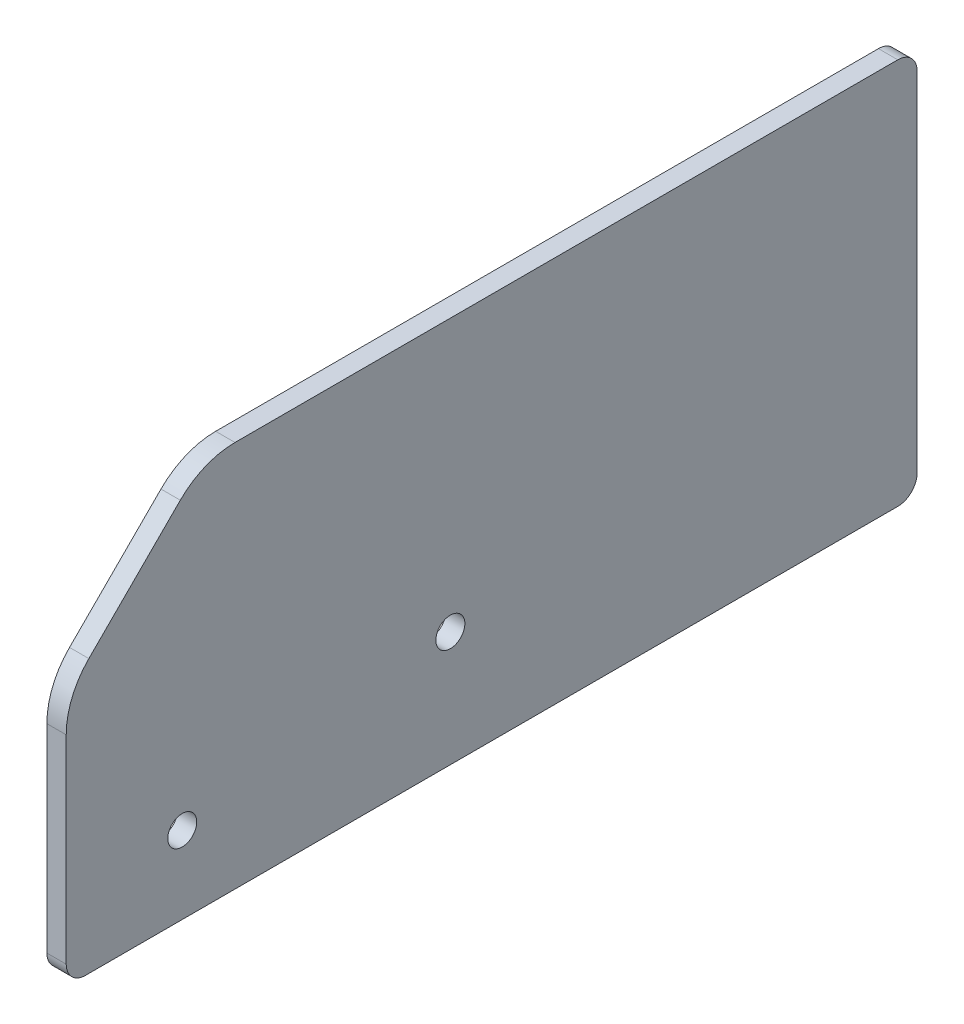
ISO-10303-21;
HEADER;
FILE_DESCRIPTION(('STEP AP214'),'2;1');
FILE_NAME('part.step','',(''),(''),'','','');
FILE_SCHEMA(('AUTOMOTIVE_DESIGN { 1 0 10303 214 1 1 1 1 }'));
ENDSEC;
DATA;
#1=APPLICATION_CONTEXT('core data for automotive mechanical design processes');
#2=APPLICATION_PROTOCOL_DEFINITION('international standard','automotive_design',2000,#1);
#3=PRODUCT_CONTEXT('',#1,'mechanical');
#4=PRODUCT('Part','Part','',(#3));
#5=PRODUCT_RELATED_PRODUCT_CATEGORY('part','',(#4));
#6=PRODUCT_DEFINITION_FORMATION('','',#4);
#7=PRODUCT_DEFINITION_CONTEXT('part definition',#1,'design');
#8=PRODUCT_DEFINITION('design','',#6,#7);
#9=PRODUCT_DEFINITION_SHAPE('','',#8);
#10=(LENGTH_UNIT() NAMED_UNIT(*) SI_UNIT(.MILLI.,.METRE.));
#11=(NAMED_UNIT(*) PLANE_ANGLE_UNIT() SI_UNIT($,.RADIAN.));
#12=(NAMED_UNIT(*) SI_UNIT($,.STERADIAN.) SOLID_ANGLE_UNIT());
#13=UNCERTAINTY_MEASURE_WITH_UNIT(LENGTH_MEASURE(1.E-05),#10,'distance_accuracy_value','');
#14=(GEOMETRIC_REPRESENTATION_CONTEXT(3) GLOBAL_UNCERTAINTY_ASSIGNED_CONTEXT((#13)) GLOBAL_UNIT_ASSIGNED_CONTEXT((#10,
#11,#12)) REPRESENTATION_CONTEXT('',''));
#15=CARTESIAN_POINT('',(0.,0.,0.));
#16=DIRECTION('',(0.,0.,1.));
#17=DIRECTION('',(1.,0.,0.));
#18=AXIS2_PLACEMENT_3D('',#15,#16,#17);
#19=CARTESIAN_POINT('',(6.35,101.6,-55.4223050896223));
#20=DIRECTION('',(-1.,0.,0.));
#21=DIRECTION('',(0.,0.,1.));
#22=AXIS2_PLACEMENT_3D('',#19,#20,#21);
#23=PLANE('',#22);
#24=CARTESIAN_POINT('',(6.35,101.6,-55.4223050896223));
#25=DIRECTION('',(1.,0.,0.));
#26=DIRECTION('',(0.,0.,1.));
#27=AXIS2_PLACEMENT_3D('',#24,#25,#26);
#28=CIRCLE('',#27,25.4);
#29=CARTESIAN_POINT('',(6.35,127.,-55.4223050896224));
#30=VERTEX_POINT('',#29);
#31=CARTESIAN_POINT('',(6.35,119.560512242138,-37.4617928474839));
#32=VERTEX_POINT('',#31);
#33=EDGE_CURVE('E161',#30,#32,#28,.T.);
#34=ORIENTED_EDGE('',*,*,#33,.T.);
#35=DIRECTION('',(0.,-0.707106781186549,0.707106781186546));
#36=VECTOR('',#35,1.);
#37=CARTESIAN_POINT('',(6.35,89.5382071525159,-7.43948775786173));
#38=LINE('',#37,#36);
#39=CARTESIAN_POINT('',(6.35,89.5382071525159,-7.43948775786173));
#40=VERTEX_POINT('',#39);
#41=EDGE_CURVE('E99',#32,#40,#38,.T.);
#42=ORIENTED_EDGE('',*,*,#41,.T.);
#43=CARTESIAN_POINT('',(6.35,71.5776949103776,-25.4));
#44=DIRECTION('',(1.,0.,0.));
#45=DIRECTION('',(0.,0.,-1.));
#46=AXIS2_PLACEMENT_3D('',#43,#44,#45);
#47=CIRCLE('',#46,25.4);
#48=CARTESIAN_POINT('',(6.35,71.5776949103775,0.));
#49=VERTEX_POINT('',#48);
#50=EDGE_CURVE('E182',#40,#49,#47,.T.);
#51=ORIENTED_EDGE('',*,*,#50,.T.);
#52=DIRECTION('',(0.,-1.,0.));
#53=VECTOR('',#52,1.);
#54=CARTESIAN_POINT('',(6.35,6.35000000000004,0.));
#55=LINE('',#54,#53);
#56=CARTESIAN_POINT('',(6.35,6.35000000000004,0.));
#57=VERTEX_POINT('',#56);
#58=EDGE_CURVE('E201',#49,#57,#55,.T.);
#59=ORIENTED_EDGE('',*,*,#58,.T.);
#60=CARTESIAN_POINT('',(6.35,6.35,-6.35));
#61=DIRECTION('',(1.,0.,0.));
#62=DIRECTION('',(0.,0.,1.));
#63=AXIS2_PLACEMENT_3D('',#60,#61,#62);
#64=CIRCLE('',#63,6.35);
#65=CARTESIAN_POINT('',(6.35,0.,-6.35000000000004));
#66=VERTEX_POINT('',#65);
#67=EDGE_CURVE('E198',#57,#66,#64,.T.);
#68=ORIENTED_EDGE('',*,*,#67,.T.);
#69=DIRECTION('',(0.,0.,-1.));
#70=VECTOR('',#69,1.);
#71=CARTESIAN_POINT('',(6.35,0.,-6.35000000000004));
#72=LINE('',#71,#70);
#73=CARTESIAN_POINT('',(6.35,0.,-273.05));
#74=VERTEX_POINT('',#73);
#75=EDGE_CURVE('E200',#66,#74,#72,.T.);
#76=ORIENTED_EDGE('',*,*,#75,.T.);
#77=CARTESIAN_POINT('',(6.35,6.35,-273.05));
#78=DIRECTION('',(1.,0.,0.));
#79=DIRECTION('',(0.,0.,-1.));
#80=AXIS2_PLACEMENT_3D('',#77,#78,#79);
#81=CIRCLE('',#80,6.35000000000001);
#82=CARTESIAN_POINT('',(6.35,6.35,-279.4));
#83=VERTEX_POINT('',#82);
#84=EDGE_CURVE('E124',#74,#83,#81,.T.);
#85=ORIENTED_EDGE('',*,*,#84,.T.);
#86=DIRECTION('',(0.,1.,0.));
#87=VECTOR('',#86,1.);
#88=CARTESIAN_POINT('',(6.35,6.35,-279.4));
#89=LINE('',#88,#87);
#90=CARTESIAN_POINT('',(6.35,120.65,-279.4));
#91=VERTEX_POINT('',#90);
#92=EDGE_CURVE('E118',#83,#91,#89,.T.);
#93=ORIENTED_EDGE('',*,*,#92,.T.);
#94=CARTESIAN_POINT('',(6.35,120.65,-273.05));
#95=DIRECTION('',(1.,0.,0.));
#96=DIRECTION('',(0.,0.,1.));
#97=AXIS2_PLACEMENT_3D('',#94,#95,#96);
#98=CIRCLE('',#97,6.35000000000001);
#99=CARTESIAN_POINT('',(6.35,127.,-273.05));
#100=VERTEX_POINT('',#99);
#101=EDGE_CURVE('E122',#91,#100,#98,.T.);
#102=ORIENTED_EDGE('',*,*,#101,.T.);
#103=DIRECTION('',(0.,0.,1.));
#104=VECTOR('',#103,1.);
#105=CARTESIAN_POINT('',(6.35,127.,-55.4223050896224));
#106=LINE('',#105,#104);
#107=EDGE_CURVE('E50',#100,#30,#106,.T.);
#108=ORIENTED_EDGE('',*,*,#107,.T.);
#109=EDGE_LOOP('',(#34,#42,#51,#59,#68,#76,#85,#93,#102,#108));
#110=FACE_BOUND('',#109,.T.);
#111=CARTESIAN_POINT('',(6.35,25.4,-38.1));
#112=DIRECTION('',(1.,0.,0.));
#113=DIRECTION('',(0.,0.,-1.));
#114=AXIS2_PLACEMENT_3D('',#111,#112,#113);
#115=CIRCLE('',#114,4.7625);
#116=CARTESIAN_POINT('',(6.35,25.4,-42.8625));
#117=VERTEX_POINT('',#116);
#118=EDGE_CURVE('E146',#117,#117,#115,.T.);
#119=ORIENTED_EDGE('',*,*,#118,.F.);
#120=EDGE_LOOP('',(#119));
#121=FACE_BOUND('',#120,.T.);
#122=CARTESIAN_POINT('',(6.35,37.7724886753493,-126.134831311126));
#123=DIRECTION('',(1.,0.,0.));
#124=DIRECTION('',(0.,0.,-1.));
#125=AXIS2_PLACEMENT_3D('',#122,#123,#124);
#126=CIRCLE('',#125,4.76250000000001);
#127=CARTESIAN_POINT('',(6.35,37.7724886753493,-130.897331311126));
#128=VERTEX_POINT('',#127);
#129=EDGE_CURVE('E212',#128,#128,#126,.T.);
#130=ORIENTED_EDGE('',*,*,#129,.F.);
#131=EDGE_LOOP('',(#130));
#132=FACE_BOUND('',#131,.T.);
#133=ADVANCED_FACE('F33',(#110,#121,#132),#23,.F.);
#134=CARTESIAN_POINT('',(0.,101.6,-55.4223050896223));
#135=DIRECTION('',(-1.,0.,0.));
#136=DIRECTION('',(0.,0.,1.));
#137=AXIS2_PLACEMENT_3D('',#134,#135,#136);
#138=PLANE('',#137);
#139=CARTESIAN_POINT('',(0.,25.4,-38.1));
#140=DIRECTION('',(1.,0.,0.));
#141=DIRECTION('',(0.,0.,-1.));
#142=AXIS2_PLACEMENT_3D('',#139,#140,#141);
#143=CIRCLE('',#142,4.7625);
#144=CARTESIAN_POINT('',(0.,25.4,-42.8625));
#145=VERTEX_POINT('',#144);
#146=EDGE_CURVE('E209',#145,#145,#143,.T.);
#147=ORIENTED_EDGE('',*,*,#146,.T.);
#148=EDGE_LOOP('',(#147));
#149=FACE_BOUND('',#148,.T.);
#150=CARTESIAN_POINT('',(0.,101.6,-55.4223050896223));
#151=DIRECTION('',(1.,0.,0.));
#152=DIRECTION('',(0.,0.,1.));
#153=AXIS2_PLACEMENT_3D('',#150,#151,#152);
#154=CIRCLE('',#153,25.4);
#155=CARTESIAN_POINT('',(0.,127.,-55.4223050896224));
#156=VERTEX_POINT('',#155);
#157=CARTESIAN_POINT('',(0.,119.560512242138,-37.4617928474839));
#158=VERTEX_POINT('',#157);
#159=EDGE_CURVE('E142',#156,#158,#154,.T.);
#160=ORIENTED_EDGE('',*,*,#159,.F.);
#161=DIRECTION('',(0.,0.,1.));
#162=VECTOR('',#161,1.);
#163=CARTESIAN_POINT('',(0.,127.,-55.4223050896224));
#164=LINE('',#163,#162);
#165=CARTESIAN_POINT('',(0.,127.,-273.05));
#166=VERTEX_POINT('',#165);
#167=EDGE_CURVE('E91',#166,#156,#164,.T.);
#168=ORIENTED_EDGE('',*,*,#167,.F.);
#169=CARTESIAN_POINT('',(0.,120.65,-273.05));
#170=DIRECTION('',(1.,0.,0.));
#171=DIRECTION('',(0.,0.,1.));
#172=AXIS2_PLACEMENT_3D('',#169,#170,#171);
#173=CIRCLE('',#172,6.35000000000001);
#174=CARTESIAN_POINT('',(0.,120.65,-279.4));
#175=VERTEX_POINT('',#174);
#176=EDGE_CURVE('E85',#175,#166,#173,.T.);
#177=ORIENTED_EDGE('',*,*,#176,.F.);
#178=DIRECTION('',(0.,1.,0.));
#179=VECTOR('',#178,1.);
#180=CARTESIAN_POINT('',(0.,6.35,-279.4));
#181=LINE('',#180,#179);
#182=CARTESIAN_POINT('',(0.,6.35,-279.4));
#183=VERTEX_POINT('',#182);
#184=EDGE_CURVE('E132',#183,#175,#181,.T.);
#185=ORIENTED_EDGE('',*,*,#184,.F.);
#186=CARTESIAN_POINT('',(0.,6.35,-273.05));
#187=DIRECTION('',(1.,0.,0.));
#188=DIRECTION('',(0.,0.,-1.));
#189=AXIS2_PLACEMENT_3D('',#186,#187,#188);
#190=CIRCLE('',#189,6.35000000000001);
#191=CARTESIAN_POINT('',(0.,0.,-273.05));
#192=VERTEX_POINT('',#191);
#193=EDGE_CURVE('E156',#192,#183,#190,.T.);
#194=ORIENTED_EDGE('',*,*,#193,.F.);
#195=DIRECTION('',(0.,0.,-1.));
#196=VECTOR('',#195,1.);
#197=CARTESIAN_POINT('',(0.,0.,-6.35000000000004));
#198=LINE('',#197,#196);
#199=CARTESIAN_POINT('',(0.,0.,-6.35000000000004));
#200=VERTEX_POINT('',#199);
#201=EDGE_CURVE('E154',#200,#192,#198,.T.);
#202=ORIENTED_EDGE('',*,*,#201,.F.);
#203=CARTESIAN_POINT('',(0.,6.35,-6.35));
#204=DIRECTION('',(1.,0.,0.));
#205=DIRECTION('',(0.,0.,1.));
#206=AXIS2_PLACEMENT_3D('',#203,#204,#205);
#207=CIRCLE('',#206,6.35);
#208=CARTESIAN_POINT('',(0.,6.35000000000004,0.));
#209=VERTEX_POINT('',#208);
#210=EDGE_CURVE('E152',#209,#200,#207,.T.);
#211=ORIENTED_EDGE('',*,*,#210,.F.);
#212=DIRECTION('',(0.,-1.,0.));
#213=VECTOR('',#212,1.);
#214=CARTESIAN_POINT('',(0.,6.35000000000004,0.));
#215=LINE('',#214,#213);
#216=CARTESIAN_POINT('',(0.,71.5776949103775,0.));
#217=VERTEX_POINT('',#216);
#218=EDGE_CURVE('E150',#217,#209,#215,.T.);
#219=ORIENTED_EDGE('',*,*,#218,.F.);
#220=CARTESIAN_POINT('',(0.,71.5776949103776,-25.4));
#221=DIRECTION('',(1.,0.,0.));
#222=DIRECTION('',(0.,0.,-1.));
#223=AXIS2_PLACEMENT_3D('',#220,#221,#222);
#224=CIRCLE('',#223,25.4);
#225=CARTESIAN_POINT('',(0.,89.5382071525159,-7.43948775786173));
#226=VERTEX_POINT('',#225);
#227=EDGE_CURVE('E148',#226,#217,#224,.T.);
#228=ORIENTED_EDGE('',*,*,#227,.F.);
#229=DIRECTION('',(0.,-0.707106781186549,0.707106781186546));
#230=VECTOR('',#229,1.);
#231=CARTESIAN_POINT('',(0.,89.5382071525159,-7.43948775786173));
#232=LINE('',#231,#230);
#233=EDGE_CURVE('E145',#158,#226,#232,.T.);
#234=ORIENTED_EDGE('',*,*,#233,.F.);
#235=EDGE_LOOP('',(#160,#168,#177,#185,#194,#202,#211,#219,#228,#234));
#236=FACE_BOUND('',#235,.T.);
#237=CARTESIAN_POINT('',(0.,37.7724886753493,-126.134831311126));
#238=DIRECTION('',(1.,0.,0.));
#239=DIRECTION('',(0.,0.,-1.));
#240=AXIS2_PLACEMENT_3D('',#237,#238,#239);
#241=CIRCLE('',#240,4.76250000000001);
#242=CARTESIAN_POINT('',(0.,37.7724886753493,-130.897331311126));
#243=VERTEX_POINT('',#242);
#244=EDGE_CURVE('E215',#243,#243,#241,.T.);
#245=ORIENTED_EDGE('',*,*,#244,.T.);
#246=EDGE_LOOP('',(#245));
#247=FACE_BOUND('',#246,.T.);
#248=ADVANCED_FACE('F186',(#149,#236,#247),#138,.T.);
#249=CARTESIAN_POINT('',(6.35,101.6,-55.4223050896223));
#250=DIRECTION('',(-1.,0.,0.));
#251=DIRECTION('',(0.,0.,1.));
#252=AXIS2_PLACEMENT_3D('',#249,#250,#251);
#253=CYLINDRICAL_SURFACE('',#252,25.4);
#254=ORIENTED_EDGE('',*,*,#159,.T.);
#255=DIRECTION('',(-1.,0.,0.));
#256=VECTOR('',#255,1.);
#257=CARTESIAN_POINT('',(6.35,119.560512242138,-37.4617928474839));
#258=LINE('',#257,#256);
#259=EDGE_CURVE('E11',#32,#158,#258,.T.);
#260=ORIENTED_EDGE('',*,*,#259,.F.);
#261=ORIENTED_EDGE('',*,*,#33,.F.);
#262=DIRECTION('',(-1.,0.,0.));
#263=VECTOR('',#262,1.);
#264=CARTESIAN_POINT('',(6.35,127.,-55.4223050896224));
#265=LINE('',#264,#263);
#266=EDGE_CURVE('E138',#30,#156,#265,.T.);
#267=ORIENTED_EDGE('',*,*,#266,.T.);
#268=EDGE_LOOP('',(#254,#260,#261,#267));
#269=FACE_BOUND('',#268,.T.);
#270=ADVANCED_FACE('F35',(#269),#253,.T.);
#271=CARTESIAN_POINT('',(6.35,89.5382071525159,-7.43948775786173));
#272=DIRECTION('',(0.,-0.707106781186546,-0.707106781186549));
#273=DIRECTION('',(0.,0.707106781186549,-0.707106781186546));
#274=AXIS2_PLACEMENT_3D('',#271,#272,#273);
#275=PLANE('',#274);
#276=ORIENTED_EDGE('',*,*,#233,.T.);
#277=DIRECTION('',(-1.,0.,0.));
#278=VECTOR('',#277,1.);
#279=CARTESIAN_POINT('',(6.35,89.5382071525159,-7.43948775786173));
#280=LINE('',#279,#278);
#281=EDGE_CURVE('E42',#40,#226,#280,.T.);
#282=ORIENTED_EDGE('',*,*,#281,.F.);
#283=ORIENTED_EDGE('',*,*,#41,.F.);
#284=ORIENTED_EDGE('',*,*,#259,.T.);
#285=EDGE_LOOP('',(#276,#282,#283,#284));
#286=FACE_BOUND('',#285,.T.);
#287=ADVANCED_FACE('F255',(#286),#275,.F.);
#288=CARTESIAN_POINT('',(6.35,71.5776949103776,-25.4));
#289=DIRECTION('',(-1.,0.,0.));
#290=DIRECTION('',(0.,0.,1.));
#291=AXIS2_PLACEMENT_3D('',#288,#289,#290);
#292=CYLINDRICAL_SURFACE('',#291,25.4);
#293=ORIENTED_EDGE('',*,*,#227,.T.);
#294=DIRECTION('',(-1.,0.,0.));
#295=VECTOR('',#294,1.);
#296=CARTESIAN_POINT('',(6.35,71.5776949103775,0.));
#297=LINE('',#296,#295);
#298=EDGE_CURVE('E174',#49,#217,#297,.T.);
#299=ORIENTED_EDGE('',*,*,#298,.F.);
#300=ORIENTED_EDGE('',*,*,#50,.F.);
#301=ORIENTED_EDGE('',*,*,#281,.T.);
#302=EDGE_LOOP('',(#293,#299,#300,#301));
#303=FACE_BOUND('',#302,.T.);
#304=ADVANCED_FACE('F180',(#303),#292,.T.);
#305=CARTESIAN_POINT('',(6.35,6.35000000000004,0.));
#306=DIRECTION('',(0.,0.,-1.));
#307=DIRECTION('',(0.,1.,0.));
#308=AXIS2_PLACEMENT_3D('',#305,#306,#307);
#309=PLANE('',#308);
#310=ORIENTED_EDGE('',*,*,#218,.T.);
#311=DIRECTION('',(-1.,0.,0.));
#312=VECTOR('',#311,1.);
#313=CARTESIAN_POINT('',(6.35,6.35000000000004,0.));
#314=LINE('',#313,#312);
#315=EDGE_CURVE('E171',#57,#209,#314,.T.);
#316=ORIENTED_EDGE('',*,*,#315,.F.);
#317=ORIENTED_EDGE('',*,*,#58,.F.);
#318=ORIENTED_EDGE('',*,*,#298,.T.);
#319=EDGE_LOOP('',(#310,#316,#317,#318));
#320=FACE_BOUND('',#319,.T.);
#321=ADVANCED_FACE('F192',(#320),#309,.F.);
#322=CARTESIAN_POINT('',(6.35,6.35,-6.35));
#323=DIRECTION('',(-1.,0.,0.));
#324=DIRECTION('',(0.,0.,1.));
#325=AXIS2_PLACEMENT_3D('',#322,#323,#324);
#326=CYLINDRICAL_SURFACE('',#325,6.35);
#327=ORIENTED_EDGE('',*,*,#210,.T.);
#328=DIRECTION('',(-1.,0.,0.));
#329=VECTOR('',#328,1.);
#330=CARTESIAN_POINT('',(6.35,0.,-6.35000000000004));
#331=LINE('',#330,#329);
#332=EDGE_CURVE('E168',#66,#200,#331,.T.);
#333=ORIENTED_EDGE('',*,*,#332,.F.);
#334=ORIENTED_EDGE('',*,*,#67,.F.);
#335=ORIENTED_EDGE('',*,*,#315,.T.);
#336=EDGE_LOOP('',(#327,#333,#334,#335));
#337=FACE_BOUND('',#336,.T.);
#338=ADVANCED_FACE('F196',(#337),#326,.T.);
#339=CARTESIAN_POINT('',(6.35,0.,-6.35000000000004));
#340=DIRECTION('',(0.,1.,0.));
#341=DIRECTION('',(0.,0.,1.));
#342=AXIS2_PLACEMENT_3D('',#339,#340,#341);
#343=PLANE('',#342);
#344=ORIENTED_EDGE('',*,*,#201,.T.);
#345=DIRECTION('',(-1.,0.,0.));
#346=VECTOR('',#345,1.);
#347=CARTESIAN_POINT('',(6.35,0.,-273.05));
#348=LINE('',#347,#346);
#349=EDGE_CURVE('E165',#74,#192,#348,.T.);
#350=ORIENTED_EDGE('',*,*,#349,.F.);
#351=ORIENTED_EDGE('',*,*,#75,.F.);
#352=ORIENTED_EDGE('',*,*,#332,.T.);
#353=EDGE_LOOP('',(#344,#350,#351,#352));
#354=FACE_BOUND('',#353,.T.);
#355=ADVANCED_FACE('F245',(#354),#343,.F.);
#356=CARTESIAN_POINT('',(6.35,6.35,-273.05));
#357=DIRECTION('',(-1.,0.,0.));
#358=DIRECTION('',(0.,0.,1.));
#359=AXIS2_PLACEMENT_3D('',#356,#357,#358);
#360=CYLINDRICAL_SURFACE('',#359,6.35000000000001);
#361=ORIENTED_EDGE('',*,*,#193,.T.);
#362=DIRECTION('',(-1.,0.,0.));
#363=VECTOR('',#362,1.);
#364=CARTESIAN_POINT('',(6.35,6.35,-279.4));
#365=LINE('',#364,#363);
#366=EDGE_CURVE('E133',#83,#183,#365,.T.);
#367=ORIENTED_EDGE('',*,*,#366,.F.);
#368=ORIENTED_EDGE('',*,*,#84,.F.);
#369=ORIENTED_EDGE('',*,*,#349,.T.);
#370=EDGE_LOOP('',(#361,#367,#368,#369));
#371=FACE_BOUND('',#370,.T.);
#372=ADVANCED_FACE('F242',(#371),#360,.T.);
#373=CARTESIAN_POINT('',(6.35,6.35,-279.4));
#374=DIRECTION('',(0.,0.,1.));
#375=DIRECTION('',(1.,0.,0.));
#376=AXIS2_PLACEMENT_3D('',#373,#374,#375);
#377=PLANE('',#376);
#378=ORIENTED_EDGE('',*,*,#184,.T.);
#379=DIRECTION('',(-1.,0.,0.));
#380=VECTOR('',#379,1.);
#381=CARTESIAN_POINT('',(6.35,120.65,-279.4));
#382=LINE('',#381,#380);
#383=EDGE_CURVE('E129',#91,#175,#382,.T.);
#384=ORIENTED_EDGE('',*,*,#383,.F.);
#385=ORIENTED_EDGE('',*,*,#92,.F.);
#386=ORIENTED_EDGE('',*,*,#366,.T.);
#387=EDGE_LOOP('',(#378,#384,#385,#386));
#388=FACE_BOUND('',#387,.T.);
#389=ADVANCED_FACE('F130',(#388),#377,.F.);
#390=CARTESIAN_POINT('',(6.35,120.65,-273.05));
#391=DIRECTION('',(-1.,0.,0.));
#392=DIRECTION('',(0.,0.,1.));
#393=AXIS2_PLACEMENT_3D('',#390,#391,#392);
#394=CYLINDRICAL_SURFACE('',#393,6.35000000000001);
#395=ORIENTED_EDGE('',*,*,#176,.T.);
#396=DIRECTION('',(-1.,0.,0.));
#397=VECTOR('',#396,1.);
#398=CARTESIAN_POINT('',(6.35,127.,-273.05));
#399=LINE('',#398,#397);
#400=EDGE_CURVE('E134',#100,#166,#399,.T.);
#401=ORIENTED_EDGE('',*,*,#400,.F.);
#402=ORIENTED_EDGE('',*,*,#101,.F.);
#403=ORIENTED_EDGE('',*,*,#383,.T.);
#404=EDGE_LOOP('',(#395,#401,#402,#403));
#405=FACE_BOUND('',#404,.T.);
#406=ADVANCED_FACE('F136',(#405),#394,.T.);
#407=CARTESIAN_POINT('',(6.35,127.,-55.4223050896224));
#408=DIRECTION('',(0.,-1.,0.));
#409=DIRECTION('',(0.,0.,-1.));
#410=AXIS2_PLACEMENT_3D('',#407,#408,#409);
#411=PLANE('',#410);
#412=ORIENTED_EDGE('',*,*,#167,.T.);
#413=ORIENTED_EDGE('',*,*,#266,.F.);
#414=ORIENTED_EDGE('',*,*,#107,.F.);
#415=ORIENTED_EDGE('',*,*,#400,.T.);
#416=EDGE_LOOP('',(#412,#413,#414,#415));
#417=FACE_BOUND('',#416,.T.);
#418=ADVANCED_FACE('F235',(#417),#411,.F.);
#419=CARTESIAN_POINT('',(6.35,25.4,-38.1));
#420=DIRECTION('',(-1.,0.,0.));
#421=DIRECTION('',(0.,0.,1.));
#422=AXIS2_PLACEMENT_3D('',#419,#420,#421);
#423=CYLINDRICAL_SURFACE('',#422,4.7625);
#424=ORIENTED_EDGE('',*,*,#118,.T.);
#425=EDGE_LOOP('',(#424));
#426=FACE_BOUND('',#425,.T.);
#427=ORIENTED_EDGE('',*,*,#146,.F.);
#428=EDGE_LOOP('',(#427));
#429=FACE_BOUND('',#428,.T.);
#430=ADVANCED_FACE('F232',(#426,#429),#423,.F.);
#431=CARTESIAN_POINT('',(6.35,37.7724886753493,-126.134831311126));
#432=DIRECTION('',(-1.,0.,0.));
#433=DIRECTION('',(0.,0.,1.));
#434=AXIS2_PLACEMENT_3D('',#431,#432,#433);
#435=CYLINDRICAL_SURFACE('',#434,4.76250000000001);
#436=ORIENTED_EDGE('',*,*,#129,.T.);
#437=EDGE_LOOP('',(#436));
#438=FACE_BOUND('',#437,.T.);
#439=ORIENTED_EDGE('',*,*,#244,.F.);
#440=EDGE_LOOP('',(#439));
#441=FACE_BOUND('',#440,.T.);
#442=ADVANCED_FACE('F221',(#438,#441),#435,.F.);
#443=CLOSED_SHELL('',(#133,#248,#270,#287,#304,#321,#338,#355,#372,#389,#406,#418,#430,#442));
#444=MANIFOLD_SOLID_BREP('B2',#443);
#445=ADVANCED_BREP_SHAPE_REPRESENTATION('',(#18,#444),#14);
#446=SHAPE_DEFINITION_REPRESENTATION(#9,#445);
ENDSEC;
END-ISO-10303-21;
